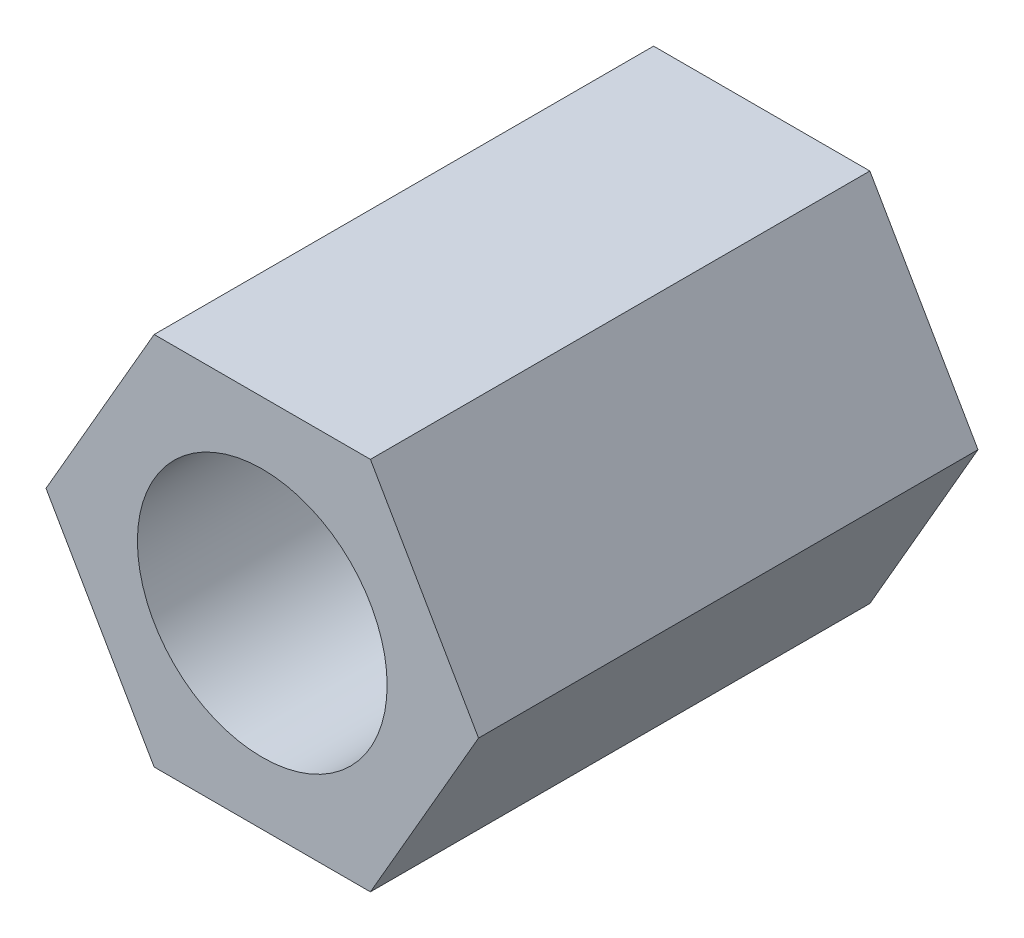
ISO-10303-21;
HEADER;
FILE_DESCRIPTION(('STEP AP214'),'2;1');
FILE_NAME('part.step','',(''),(''),'','','');
FILE_SCHEMA(('AUTOMOTIVE_DESIGN { 1 0 10303 214 1 1 1 1 }'));
ENDSEC;
DATA;
#1=APPLICATION_CONTEXT('core data for automotive mechanical design processes');
#2=APPLICATION_PROTOCOL_DEFINITION('international standard','automotive_design',2000,#1);
#3=PRODUCT_CONTEXT('',#1,'mechanical');
#4=PRODUCT('Part','Part','',(#3));
#5=PRODUCT_RELATED_PRODUCT_CATEGORY('part','',(#4));
#6=PRODUCT_DEFINITION_FORMATION('','',#4);
#7=PRODUCT_DEFINITION_CONTEXT('part definition',#1,'design');
#8=PRODUCT_DEFINITION('design','',#6,#7);
#9=PRODUCT_DEFINITION_SHAPE('','',#8);
#10=(LENGTH_UNIT() NAMED_UNIT(*) SI_UNIT(.MILLI.,.METRE.));
#11=(NAMED_UNIT(*) PLANE_ANGLE_UNIT() SI_UNIT($,.RADIAN.));
#12=(NAMED_UNIT(*) SI_UNIT($,.STERADIAN.) SOLID_ANGLE_UNIT());
#13=UNCERTAINTY_MEASURE_WITH_UNIT(LENGTH_MEASURE(1.E-05),#10,'distance_accuracy_value','');
#14=(GEOMETRIC_REPRESENTATION_CONTEXT(3) GLOBAL_UNCERTAINTY_ASSIGNED_CONTEXT((#13)) GLOBAL_UNIT_ASSIGNED_CONTEXT((#10,
#11,#12)) REPRESENTATION_CONTEXT('',''));
#15=CARTESIAN_POINT('',(0.,0.,0.));
#16=DIRECTION('',(0.,0.,1.));
#17=DIRECTION('',(1.,0.,0.));
#18=AXIS2_PLACEMENT_3D('',#15,#16,#17);
#19=CARTESIAN_POINT('',(0.,0.,8.));
#20=DIRECTION('',(0.,0.,1.));
#21=DIRECTION('',(1.,0.,0.));
#22=AXIS2_PLACEMENT_3D('',#19,#20,#21);
#23=PLANE('',#22);
#24=DIRECTION('',(0.5,0.866025403784439,0.));
#25=VECTOR('',#24,1.);
#26=CARTESIAN_POINT('',(1.73205080756888,-3.,8.));
#27=LINE('',#26,#25);
#28=CARTESIAN_POINT('',(1.73205080756888,-3.,8.));
#29=VERTEX_POINT('',#28);
#30=CARTESIAN_POINT('',(3.46410161513776,0.,8.));
#31=VERTEX_POINT('',#30);
#32=EDGE_CURVE('E137',#29,#31,#27,.T.);
#33=ORIENTED_EDGE('',*,*,#32,.T.);
#34=DIRECTION('',(-0.5,0.866025403784438,0.));
#35=VECTOR('',#34,1.);
#36=CARTESIAN_POINT('',(3.46410161513776,0.,8.));
#37=LINE('',#36,#35);
#38=CARTESIAN_POINT('',(1.73205080756888,3.,8.));
#39=VERTEX_POINT('',#38);
#40=EDGE_CURVE('E95',#31,#39,#37,.T.);
#41=ORIENTED_EDGE('',*,*,#40,.T.);
#42=DIRECTION('',(-1.,0.,0.));
#43=VECTOR('',#42,1.);
#44=CARTESIAN_POINT('',(1.73205080756888,3.,8.));
#45=LINE('',#44,#43);
#46=CARTESIAN_POINT('',(-1.73205080756888,3.,8.));
#47=VERTEX_POINT('',#46);
#48=EDGE_CURVE('E108',#39,#47,#45,.T.);
#49=ORIENTED_EDGE('',*,*,#48,.T.);
#50=DIRECTION('',(-0.5,-0.866025403784439,0.));
#51=VECTOR('',#50,1.);
#52=CARTESIAN_POINT('',(-1.73205080756888,3.,8.));
#53=LINE('',#52,#51);
#54=CARTESIAN_POINT('',(-3.46410161513775,0.,8.));
#55=VERTEX_POINT('',#54);
#56=EDGE_CURVE('E102',#47,#55,#53,.T.);
#57=ORIENTED_EDGE('',*,*,#56,.T.);
#58=DIRECTION('',(0.5,-0.866025403784439,0.));
#59=VECTOR('',#58,1.);
#60=CARTESIAN_POINT('',(-3.46410161513775,0.,8.));
#61=LINE('',#60,#59);
#62=CARTESIAN_POINT('',(-1.73205080756888,-3.,8.));
#63=VERTEX_POINT('',#62);
#64=EDGE_CURVE('E106',#55,#63,#61,.T.);
#65=ORIENTED_EDGE('',*,*,#64,.T.);
#66=DIRECTION('',(1.,0.,0.));
#67=VECTOR('',#66,1.);
#68=CARTESIAN_POINT('',(-1.73205080756888,-3.,8.));
#69=LINE('',#68,#67);
#70=EDGE_CURVE('E58',#63,#29,#69,.T.);
#71=ORIENTED_EDGE('',*,*,#70,.T.);
#72=EDGE_LOOP('',(#33,#41,#49,#57,#65,#71));
#73=FACE_BOUND('',#72,.T.);
#74=CARTESIAN_POINT('',(0.,0.,8.));
#75=DIRECTION('',(0.,0.,1.));
#76=DIRECTION('',(1.,0.,0.));
#77=AXIS2_PLACEMENT_3D('',#74,#75,#76);
#78=CIRCLE('',#77,2.);
#79=CARTESIAN_POINT('',(2.,0.,8.));
#80=VERTEX_POINT('',#79);
#81=EDGE_CURVE('E130',#80,#80,#78,.T.);
#82=ORIENTED_EDGE('',*,*,#81,.F.);
#83=EDGE_LOOP('',(#82));
#84=FACE_BOUND('',#83,.T.);
#85=ADVANCED_FACE('F41',(#73,#84),#23,.T.);
#86=CARTESIAN_POINT('',(0.,0.,0.));
#87=DIRECTION('',(0.,0.,1.));
#88=DIRECTION('',(1.,0.,0.));
#89=AXIS2_PLACEMENT_3D('',#86,#87,#88);
#90=PLANE('',#89);
#91=DIRECTION('',(0.5,0.866025403784439,0.));
#92=VECTOR('',#91,1.);
#93=CARTESIAN_POINT('',(1.73205080756888,-3.,0.));
#94=LINE('',#93,#92);
#95=CARTESIAN_POINT('',(1.73205080756888,-3.,0.));
#96=VERTEX_POINT('',#95);
#97=CARTESIAN_POINT('',(3.46410161513776,0.,0.));
#98=VERTEX_POINT('',#97);
#99=EDGE_CURVE('E126',#96,#98,#94,.T.);
#100=ORIENTED_EDGE('',*,*,#99,.F.);
#101=DIRECTION('',(1.,0.,0.));
#102=VECTOR('',#101,1.);
#103=CARTESIAN_POINT('',(-1.73205080756888,-3.,0.));
#104=LINE('',#103,#102);
#105=CARTESIAN_POINT('',(-1.73205080756888,-3.,0.));
#106=VERTEX_POINT('',#105);
#107=EDGE_CURVE('E87',#106,#96,#104,.T.);
#108=ORIENTED_EDGE('',*,*,#107,.F.);
#109=DIRECTION('',(0.5,-0.866025403784439,0.));
#110=VECTOR('',#109,1.);
#111=CARTESIAN_POINT('',(-3.46410161513775,0.,0.));
#112=LINE('',#111,#110);
#113=CARTESIAN_POINT('',(-3.46410161513775,0.,0.));
#114=VERTEX_POINT('',#113);
#115=EDGE_CURVE('E81',#114,#106,#112,.T.);
#116=ORIENTED_EDGE('',*,*,#115,.F.);
#117=DIRECTION('',(-0.5,-0.866025403784439,0.));
#118=VECTOR('',#117,1.);
#119=CARTESIAN_POINT('',(-1.73205080756888,3.,0.));
#120=LINE('',#119,#118);
#121=CARTESIAN_POINT('',(-1.73205080756888,3.,0.));
#122=VERTEX_POINT('',#121);
#123=EDGE_CURVE('E116',#122,#114,#120,.T.);
#124=ORIENTED_EDGE('',*,*,#123,.F.);
#125=DIRECTION('',(-1.,0.,0.));
#126=VECTOR('',#125,1.);
#127=CARTESIAN_POINT('',(1.73205080756888,3.,0.));
#128=LINE('',#127,#126);
#129=CARTESIAN_POINT('',(1.73205080756888,3.,0.));
#130=VERTEX_POINT('',#129);
#131=EDGE_CURVE('E132',#130,#122,#128,.T.);
#132=ORIENTED_EDGE('',*,*,#131,.F.);
#133=DIRECTION('',(-0.5,0.866025403784438,0.));
#134=VECTOR('',#133,1.);
#135=CARTESIAN_POINT('',(3.46410161513776,0.,0.));
#136=LINE('',#135,#134);
#137=EDGE_CURVE('E129',#98,#130,#136,.T.);
#138=ORIENTED_EDGE('',*,*,#137,.F.);
#139=EDGE_LOOP('',(#100,#108,#116,#124,#132,#138));
#140=FACE_BOUND('',#139,.T.);
#141=CARTESIAN_POINT('',(0.,0.,0.));
#142=DIRECTION('',(0.,0.,1.));
#143=DIRECTION('',(1.,0.,0.));
#144=AXIS2_PLACEMENT_3D('',#141,#142,#143);
#145=CIRCLE('',#144,2.);
#146=CARTESIAN_POINT('',(2.,0.,0.));
#147=VERTEX_POINT('',#146);
#148=EDGE_CURVE('E230',#147,#147,#145,.T.);
#149=ORIENTED_EDGE('',*,*,#148,.T.);
#150=EDGE_LOOP('',(#149));
#151=FACE_BOUND('',#150,.T.);
#152=ADVANCED_FACE('F146',(#140,#151),#90,.F.);
#153=CARTESIAN_POINT('',(1.73205080756888,-3.,8.));
#154=DIRECTION('',(-0.866025403784439,0.5,0.));
#155=DIRECTION('',(-0.5,-0.866025403784439,0.));
#156=AXIS2_PLACEMENT_3D('',#153,#154,#155);
#157=PLANE('',#156);
#158=ORIENTED_EDGE('',*,*,#99,.T.);
#159=DIRECTION('',(0.,0.,-1.));
#160=VECTOR('',#159,1.);
#161=CARTESIAN_POINT('',(3.46410161513776,0.,8.));
#162=LINE('',#161,#160);
#163=EDGE_CURVE('E11',#31,#98,#162,.T.);
#164=ORIENTED_EDGE('',*,*,#163,.F.);
#165=ORIENTED_EDGE('',*,*,#32,.F.);
#166=DIRECTION('',(0.,0.,-1.));
#167=VECTOR('',#166,1.);
#168=CARTESIAN_POINT('',(1.73205080756888,-3.,8.));
#169=LINE('',#168,#167);
#170=EDGE_CURVE('E122',#29,#96,#169,.T.);
#171=ORIENTED_EDGE('',*,*,#170,.T.);
#172=EDGE_LOOP('',(#158,#164,#165,#171));
#173=FACE_BOUND('',#172,.T.);
#174=ADVANCED_FACE('F43',(#173),#157,.F.);
#175=CARTESIAN_POINT('',(3.46410161513776,0.,8.));
#176=DIRECTION('',(-0.866025403784439,-0.5,0.));
#177=DIRECTION('',(0.5,-0.866025403784438,0.));
#178=AXIS2_PLACEMENT_3D('',#175,#176,#177);
#179=PLANE('',#178);
#180=ORIENTED_EDGE('',*,*,#137,.T.);
#181=DIRECTION('',(0.,0.,-1.));
#182=VECTOR('',#181,1.);
#183=CARTESIAN_POINT('',(1.73205080756888,3.,8.));
#184=LINE('',#183,#182);
#185=EDGE_CURVE('E50',#39,#130,#184,.T.);
#186=ORIENTED_EDGE('',*,*,#185,.F.);
#187=ORIENTED_EDGE('',*,*,#40,.F.);
#188=ORIENTED_EDGE('',*,*,#163,.T.);
#189=EDGE_LOOP('',(#180,#186,#187,#188));
#190=FACE_BOUND('',#189,.T.);
#191=ADVANCED_FACE('F171',(#190),#179,.F.);
#192=CARTESIAN_POINT('',(1.73205080756888,3.,8.));
#193=DIRECTION('',(0.,-1.,0.));
#194=DIRECTION('',(0.,0.,-1.));
#195=AXIS2_PLACEMENT_3D('',#192,#193,#194);
#196=PLANE('',#195);
#197=ORIENTED_EDGE('',*,*,#131,.T.);
#198=DIRECTION('',(0.,0.,-1.));
#199=VECTOR('',#198,1.);
#200=CARTESIAN_POINT('',(-1.73205080756888,3.,8.));
#201=LINE('',#200,#199);
#202=EDGE_CURVE('E117',#47,#122,#201,.T.);
#203=ORIENTED_EDGE('',*,*,#202,.F.);
#204=ORIENTED_EDGE('',*,*,#48,.F.);
#205=ORIENTED_EDGE('',*,*,#185,.T.);
#206=EDGE_LOOP('',(#197,#203,#204,#205));
#207=FACE_BOUND('',#206,.T.);
#208=ADVANCED_FACE('F143',(#207),#196,.F.);
#209=CARTESIAN_POINT('',(-1.73205080756888,3.,8.));
#210=DIRECTION('',(0.866025403784439,-0.5,0.));
#211=DIRECTION('',(0.5,0.866025403784439,0.));
#212=AXIS2_PLACEMENT_3D('',#209,#210,#211);
#213=PLANE('',#212);
#214=ORIENTED_EDGE('',*,*,#123,.T.);
#215=DIRECTION('',(0.,0.,-1.));
#216=VECTOR('',#215,1.);
#217=CARTESIAN_POINT('',(-3.46410161513775,0.,8.));
#218=LINE('',#217,#216);
#219=EDGE_CURVE('E113',#55,#114,#218,.T.);
#220=ORIENTED_EDGE('',*,*,#219,.F.);
#221=ORIENTED_EDGE('',*,*,#56,.F.);
#222=ORIENTED_EDGE('',*,*,#202,.T.);
#223=EDGE_LOOP('',(#214,#220,#221,#222));
#224=FACE_BOUND('',#223,.T.);
#225=ADVANCED_FACE('F114',(#224),#213,.F.);
#226=CARTESIAN_POINT('',(-3.46410161513775,0.,8.));
#227=DIRECTION('',(0.866025403784439,0.5,0.));
#228=DIRECTION('',(-0.5,0.866025403784439,0.));
#229=AXIS2_PLACEMENT_3D('',#226,#227,#228);
#230=PLANE('',#229);
#231=ORIENTED_EDGE('',*,*,#115,.T.);
#232=DIRECTION('',(0.,0.,-1.));
#233=VECTOR('',#232,1.);
#234=CARTESIAN_POINT('',(-1.73205080756888,-3.,8.));
#235=LINE('',#234,#233);
#236=EDGE_CURVE('E118',#63,#106,#235,.T.);
#237=ORIENTED_EDGE('',*,*,#236,.F.);
#238=ORIENTED_EDGE('',*,*,#64,.F.);
#239=ORIENTED_EDGE('',*,*,#219,.T.);
#240=EDGE_LOOP('',(#231,#237,#238,#239));
#241=FACE_BOUND('',#240,.T.);
#242=ADVANCED_FACE('F120',(#241),#230,.F.);
#243=CARTESIAN_POINT('',(-1.73205080756888,-3.,8.));
#244=DIRECTION('',(0.,1.,0.));
#245=DIRECTION('',(0.,0.,1.));
#246=AXIS2_PLACEMENT_3D('',#243,#244,#245);
#247=PLANE('',#246);
#248=ORIENTED_EDGE('',*,*,#107,.T.);
#249=ORIENTED_EDGE('',*,*,#170,.F.);
#250=ORIENTED_EDGE('',*,*,#70,.F.);
#251=ORIENTED_EDGE('',*,*,#236,.T.);
#252=EDGE_LOOP('',(#248,#249,#250,#251));
#253=FACE_BOUND('',#252,.T.);
#254=ADVANCED_FACE('F151',(#253),#247,.F.);
#255=CARTESIAN_POINT('',(0.,0.,8.));
#256=DIRECTION('',(0.,0.,-1.));
#257=DIRECTION('',(-1.,0.,0.));
#258=AXIS2_PLACEMENT_3D('',#255,#256,#257);
#259=CYLINDRICAL_SURFACE('',#258,2.);
#260=ORIENTED_EDGE('',*,*,#81,.T.);
#261=EDGE_LOOP('',(#260));
#262=FACE_BOUND('',#261,.T.);
#263=ORIENTED_EDGE('',*,*,#148,.F.);
#264=EDGE_LOOP('',(#263));
#265=FACE_BOUND('',#264,.T.);
#266=ADVANCED_FACE('F153',(#262,#265),#259,.F.);
#267=CLOSED_SHELL('',(#85,#152,#174,#191,#208,#225,#242,#254,#266));
#268=MANIFOLD_SOLID_BREP('B2',#267);
#269=ADVANCED_BREP_SHAPE_REPRESENTATION('',(#18,#268),#14);
#270=SHAPE_DEFINITION_REPRESENTATION(#9,#269);
ENDSEC;
END-ISO-10303-21;
